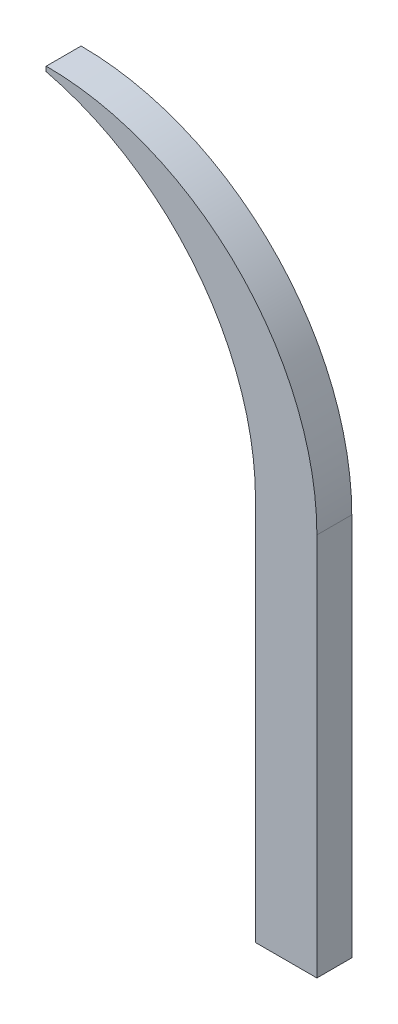
ISO-10303-21;
HEADER;
FILE_DESCRIPTION(('STEP AP214'),'2;1');
FILE_NAME('part.step','',(''),(''),'','','');
FILE_SCHEMA(('AUTOMOTIVE_DESIGN { 1 0 10303 214 1 1 1 1 }'));
ENDSEC;
DATA;
#1=APPLICATION_CONTEXT('core data for automotive mechanical design processes');
#2=APPLICATION_PROTOCOL_DEFINITION('international standard','automotive_design',2000,#1);
#3=PRODUCT_CONTEXT('',#1,'mechanical');
#4=PRODUCT('Part','Part','',(#3));
#5=PRODUCT_RELATED_PRODUCT_CATEGORY('part','',(#4));
#6=PRODUCT_DEFINITION_FORMATION('','',#4);
#7=PRODUCT_DEFINITION_CONTEXT('part definition',#1,'design');
#8=PRODUCT_DEFINITION('design','',#6,#7);
#9=PRODUCT_DEFINITION_SHAPE('','',#8);
#10=(LENGTH_UNIT() NAMED_UNIT(*) SI_UNIT(.MILLI.,.METRE.));
#11=(NAMED_UNIT(*) PLANE_ANGLE_UNIT() SI_UNIT($,.RADIAN.));
#12=(NAMED_UNIT(*) SI_UNIT($,.STERADIAN.) SOLID_ANGLE_UNIT());
#13=UNCERTAINTY_MEASURE_WITH_UNIT(LENGTH_MEASURE(1.E-05),#10,'distance_accuracy_value','');
#14=(GEOMETRIC_REPRESENTATION_CONTEXT(3) GLOBAL_UNCERTAINTY_ASSIGNED_CONTEXT((#13)) GLOBAL_UNIT_ASSIGNED_CONTEXT((#10,
#11,#12)) REPRESENTATION_CONTEXT('',''));
#15=CARTESIAN_POINT('',(0.,0.,0.));
#16=DIRECTION('',(0.,0.,1.));
#17=DIRECTION('',(1.,0.,0.));
#18=AXIS2_PLACEMENT_3D('',#15,#16,#17);
#19=CARTESIAN_POINT('',(88.9,-60.325,-454.025));
#20=DIRECTION('',(-1.,0.,0.));
#21=DIRECTION('',(0.,0.,1.));
#22=AXIS2_PLACEMENT_3D('',#19,#20,#21);
#23=PLANE('',#22);
#24=DIRECTION('',(0.,-1.,0.));
#25=VECTOR('',#24,1.);
#26=CARTESIAN_POINT('',(88.9,-60.325,-450.85));
#27=LINE('',#26,#25);
#28=CARTESIAN_POINT('',(88.9,-25.4000000000001,-450.85));
#29=VERTEX_POINT('',#28);
#30=CARTESIAN_POINT('',(88.9,-60.325,-450.85));
#31=VERTEX_POINT('',#30);
#32=EDGE_CURVE('E117',#29,#31,#27,.T.);
#33=ORIENTED_EDGE('',*,*,#32,.F.);
#34=DIRECTION('',(0.,0.,1.));
#35=VECTOR('',#34,1.);
#36=CARTESIAN_POINT('',(88.9,-25.4000000000001,-454.025));
#37=LINE('',#36,#35);
#38=CARTESIAN_POINT('',(88.9,-25.4000000000001,-454.025));
#39=VERTEX_POINT('',#38);
#40=EDGE_CURVE('E11',#39,#29,#37,.T.);
#41=ORIENTED_EDGE('',*,*,#40,.F.);
#42=DIRECTION('',(0.,-1.,0.));
#43=VECTOR('',#42,1.);
#44=CARTESIAN_POINT('',(88.9,-60.325,-454.025));
#45=LINE('',#44,#43);
#46=CARTESIAN_POINT('',(88.9,-60.325,-454.025));
#47=VERTEX_POINT('',#46);
#48=EDGE_CURVE('E131',#39,#47,#45,.T.);
#49=ORIENTED_EDGE('',*,*,#48,.T.);
#50=DIRECTION('',(0.,0.,1.));
#51=VECTOR('',#50,1.);
#52=CARTESIAN_POINT('',(88.9,-60.325,-454.025));
#53=LINE('',#52,#51);
#54=EDGE_CURVE('E35',#47,#31,#53,.T.);
#55=ORIENTED_EDGE('',*,*,#54,.T.);
#56=EDGE_LOOP('',(#33,#41,#49,#55));
#57=FACE_BOUND('',#56,.T.);
#58=ADVANCED_FACE('F32',(#57),#23,.T.);
#59=CARTESIAN_POINT('',(64.008,-25.4,-454.025));
#60=DIRECTION('',(0.,0.,1.));
#61=DIRECTION('',(1.,0.,0.));
#62=AXIS2_PLACEMENT_3D('',#59,#60,#61);
#63=CYLINDRICAL_SURFACE('',#62,24.892);
#64=CARTESIAN_POINT('',(64.008,-25.4,-450.85));
#65=DIRECTION('',(0.,0.,-1.));
#66=DIRECTION('',(1.,0.,0.));
#67=AXIS2_PLACEMENT_3D('',#64,#65,#66);
#68=CIRCLE('',#67,24.892);
#69=CARTESIAN_POINT('',(69.85,-1.20325021826278,-450.85));
#70=VERTEX_POINT('',#69);
#71=EDGE_CURVE('E129',#70,#29,#68,.T.);
#72=ORIENTED_EDGE('',*,*,#71,.F.);
#73=DIRECTION('',(0.,0.,1.));
#74=VECTOR('',#73,1.);
#75=CARTESIAN_POINT('',(69.85,-1.20325021826278,-454.025));
#76=LINE('',#75,#74);
#77=CARTESIAN_POINT('',(69.85,-1.20325021826278,-454.025));
#78=VERTEX_POINT('',#77);
#79=EDGE_CURVE('E41',#78,#70,#76,.T.);
#80=ORIENTED_EDGE('',*,*,#79,.F.);
#81=CARTESIAN_POINT('',(64.008,-25.4,-454.025));
#82=DIRECTION('',(0.,0.,-1.));
#83=DIRECTION('',(1.,0.,0.));
#84=AXIS2_PLACEMENT_3D('',#81,#82,#83);
#85=CIRCLE('',#84,24.892);
#86=EDGE_CURVE('E107',#78,#39,#85,.T.);
#87=ORIENTED_EDGE('',*,*,#86,.T.);
#88=ORIENTED_EDGE('',*,*,#40,.T.);
#89=EDGE_LOOP('',(#72,#80,#87,#88));
#90=FACE_BOUND('',#89,.T.);
#91=ADVANCED_FACE('F139',(#90),#63,.F.);
#92=CARTESIAN_POINT('',(69.85,-0.761999999999996,-454.025));
#93=DIRECTION('',(-1.,0.,0.));
#94=DIRECTION('',(0.,0.,1.));
#95=AXIS2_PLACEMENT_3D('',#92,#93,#94);
#96=PLANE('',#95);
#97=DIRECTION('',(0.,-1.,0.));
#98=VECTOR('',#97,1.);
#99=CARTESIAN_POINT('',(69.85,-0.761999999999996,-450.85));
#100=LINE('',#99,#98);
#101=CARTESIAN_POINT('',(69.85,-0.761999999999992,-450.85));
#102=VERTEX_POINT('',#101);
#103=EDGE_CURVE('E94',#102,#70,#100,.T.);
#104=ORIENTED_EDGE('',*,*,#103,.F.);
#105=DIRECTION('',(0.,0.,1.));
#106=VECTOR('',#105,1.);
#107=CARTESIAN_POINT('',(69.85,-0.761999999999992,-454.025));
#108=LINE('',#107,#106);
#109=CARTESIAN_POINT('',(69.85,-0.761999999999992,-454.025));
#110=VERTEX_POINT('',#109);
#111=EDGE_CURVE('E89',#110,#102,#108,.T.);
#112=ORIENTED_EDGE('',*,*,#111,.F.);
#113=DIRECTION('',(0.,-1.,0.));
#114=VECTOR('',#113,1.);
#115=CARTESIAN_POINT('',(69.85,-0.761999999999996,-454.025));
#116=LINE('',#115,#114);
#117=EDGE_CURVE('E92',#110,#78,#116,.T.);
#118=ORIENTED_EDGE('',*,*,#117,.T.);
#119=ORIENTED_EDGE('',*,*,#79,.T.);
#120=EDGE_LOOP('',(#104,#112,#118,#119));
#121=FACE_BOUND('',#120,.T.);
#122=ADVANCED_FACE('F91',(#121),#96,.T.);
#123=CARTESIAN_POINT('',(69.85,-25.4,-454.025));
#124=DIRECTION('',(0.,0.,1.));
#125=DIRECTION('',(1.,0.,0.));
#126=AXIS2_PLACEMENT_3D('',#123,#124,#125);
#127=CYLINDRICAL_SURFACE('',#126,24.638);
#128=CARTESIAN_POINT('',(69.85,-25.4,-450.85));
#129=DIRECTION('',(0.,0.,1.));
#130=DIRECTION('',(1.,0.,0.));
#131=AXIS2_PLACEMENT_3D('',#128,#129,#130);
#132=CIRCLE('',#131,24.638);
#133=CARTESIAN_POINT('',(94.488,-25.4000000000001,-450.85));
#134=VERTEX_POINT('',#133);
#135=EDGE_CURVE('E126',#134,#102,#132,.T.);
#136=ORIENTED_EDGE('',*,*,#135,.F.);
#137=DIRECTION('',(0.,0.,1.));
#138=VECTOR('',#137,1.);
#139=CARTESIAN_POINT('',(94.488,-25.4000000000001,-454.025));
#140=LINE('',#139,#138);
#141=CARTESIAN_POINT('',(94.488,-25.4000000000001,-454.025));
#142=VERTEX_POINT('',#141);
#143=EDGE_CURVE('E99',#142,#134,#140,.T.);
#144=ORIENTED_EDGE('',*,*,#143,.F.);
#145=CARTESIAN_POINT('',(69.85,-25.4,-454.025));
#146=DIRECTION('',(0.,0.,1.));
#147=DIRECTION('',(1.,0.,0.));
#148=AXIS2_PLACEMENT_3D('',#145,#146,#147);
#149=CIRCLE('',#148,24.638);
#150=EDGE_CURVE('E105',#142,#110,#149,.T.);
#151=ORIENTED_EDGE('',*,*,#150,.T.);
#152=ORIENTED_EDGE('',*,*,#111,.T.);
#153=EDGE_LOOP('',(#136,#144,#151,#152));
#154=FACE_BOUND('',#153,.T.);
#155=ADVANCED_FACE('F109',(#154),#127,.T.);
#156=CARTESIAN_POINT('',(94.488,-60.325,-454.025));
#157=DIRECTION('',(1.,0.,0.));
#158=DIRECTION('',(0.,0.,-1.));
#159=AXIS2_PLACEMENT_3D('',#156,#157,#158);
#160=PLANE('',#159);
#161=DIRECTION('',(0.,1.,0.));
#162=VECTOR('',#161,1.);
#163=CARTESIAN_POINT('',(94.488,-60.325,-450.85));
#164=LINE('',#163,#162);
#165=CARTESIAN_POINT('',(94.488,-60.325,-450.85));
#166=VERTEX_POINT('',#165);
#167=EDGE_CURVE('E123',#166,#134,#164,.T.);
#168=ORIENTED_EDGE('',*,*,#167,.F.);
#169=DIRECTION('',(0.,0.,1.));
#170=VECTOR('',#169,1.);
#171=CARTESIAN_POINT('',(94.488,-60.325,-454.025));
#172=LINE('',#171,#170);
#173=CARTESIAN_POINT('',(94.488,-60.325,-454.025));
#174=VERTEX_POINT('',#173);
#175=EDGE_CURVE('E134',#174,#166,#172,.T.);
#176=ORIENTED_EDGE('',*,*,#175,.F.);
#177=DIRECTION('',(0.,1.,0.));
#178=VECTOR('',#177,1.);
#179=CARTESIAN_POINT('',(94.488,-60.325,-454.025));
#180=LINE('',#179,#178);
#181=EDGE_CURVE('E110',#174,#142,#180,.T.);
#182=ORIENTED_EDGE('',*,*,#181,.T.);
#183=ORIENTED_EDGE('',*,*,#143,.T.);
#184=EDGE_LOOP('',(#168,#176,#182,#183));
#185=FACE_BOUND('',#184,.T.);
#186=ADVANCED_FACE('F152',(#185),#160,.T.);
#187=CARTESIAN_POINT('',(94.488,-60.325,-454.025));
#188=DIRECTION('',(0.,-1.,0.));
#189=DIRECTION('',(0.,0.,-1.));
#190=AXIS2_PLACEMENT_3D('',#187,#188,#189);
#191=PLANE('',#190);
#192=DIRECTION('',(1.,0.,0.));
#193=VECTOR('',#192,1.);
#194=CARTESIAN_POINT('',(94.488,-60.325,-450.85));
#195=LINE('',#194,#193);
#196=EDGE_CURVE('E120',#31,#166,#195,.T.);
#197=ORIENTED_EDGE('',*,*,#196,.F.);
#198=ORIENTED_EDGE('',*,*,#54,.F.);
#199=DIRECTION('',(1.,0.,0.));
#200=VECTOR('',#199,1.);
#201=CARTESIAN_POINT('',(94.488,-60.325,-454.025));
#202=LINE('',#201,#200);
#203=EDGE_CURVE('E112',#47,#174,#202,.T.);
#204=ORIENTED_EDGE('',*,*,#203,.T.);
#205=ORIENTED_EDGE('',*,*,#175,.T.);
#206=EDGE_LOOP('',(#197,#198,#204,#205));
#207=FACE_BOUND('',#206,.T.);
#208=ADVANCED_FACE('F136',(#207),#191,.T.);
#209=CARTESIAN_POINT('',(64.008,-25.4,-454.025));
#210=DIRECTION('',(0.,0.,1.));
#211=DIRECTION('',(1.,0.,0.));
#212=AXIS2_PLACEMENT_3D('',#209,#210,#211);
#213=PLANE('',#212);
#214=ORIENTED_EDGE('',*,*,#48,.F.);
#215=ORIENTED_EDGE('',*,*,#86,.F.);
#216=ORIENTED_EDGE('',*,*,#117,.F.);
#217=ORIENTED_EDGE('',*,*,#150,.F.);
#218=ORIENTED_EDGE('',*,*,#181,.F.);
#219=ORIENTED_EDGE('',*,*,#203,.F.);
#220=EDGE_LOOP('',(#214,#215,#216,#217,#218,#219));
#221=FACE_BOUND('',#220,.T.);
#222=ADVANCED_FACE('F103',(#221),#213,.F.);
#223=CARTESIAN_POINT('',(64.008,-25.4,-450.85));
#224=DIRECTION('',(0.,0.,1.));
#225=DIRECTION('',(1.,0.,0.));
#226=AXIS2_PLACEMENT_3D('',#223,#224,#225);
#227=PLANE('',#226);
#228=ORIENTED_EDGE('',*,*,#32,.T.);
#229=ORIENTED_EDGE('',*,*,#196,.T.);
#230=ORIENTED_EDGE('',*,*,#167,.T.);
#231=ORIENTED_EDGE('',*,*,#135,.T.);
#232=ORIENTED_EDGE('',*,*,#103,.T.);
#233=ORIENTED_EDGE('',*,*,#71,.T.);
#234=EDGE_LOOP('',(#228,#229,#230,#231,#232,#233));
#235=FACE_BOUND('',#234,.T.);
#236=ADVANCED_FACE('F138',(#235),#227,.T.);
#237=CLOSED_SHELL('',(#58,#91,#122,#155,#186,#208,#222,#236));
#238=MANIFOLD_SOLID_BREP('B2',#237);
#239=ADVANCED_BREP_SHAPE_REPRESENTATION('',(#18,#238),#14);
#240=SHAPE_DEFINITION_REPRESENTATION(#9,#239);
ENDSEC;
END-ISO-10303-21;
